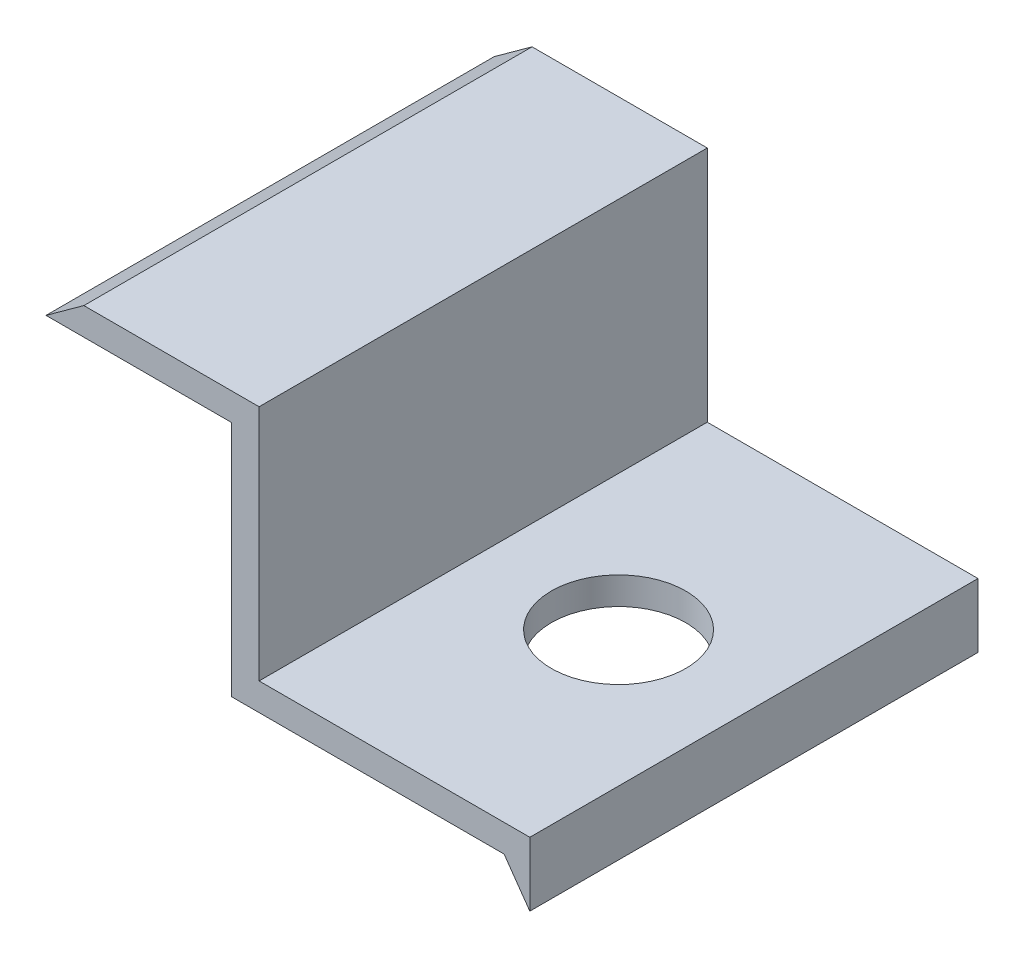
ISO-10303-21;
HEADER;
FILE_DESCRIPTION(('STEP AP214'),'2;1');
FILE_NAME('part.step','',(''),(''),'','','');
FILE_SCHEMA(('AUTOMOTIVE_DESIGN { 1 0 10303 214 1 1 1 1 }'));
ENDSEC;
DATA;
#1=APPLICATION_CONTEXT('core data for automotive mechanical design processes');
#2=APPLICATION_PROTOCOL_DEFINITION('international standard','automotive_design',2000,#1);
#3=PRODUCT_CONTEXT('',#1,'mechanical');
#4=PRODUCT('Part','Part','',(#3));
#5=PRODUCT_RELATED_PRODUCT_CATEGORY('part','',(#4));
#6=PRODUCT_DEFINITION_FORMATION('','',#4);
#7=PRODUCT_DEFINITION_CONTEXT('part definition',#1,'design');
#8=PRODUCT_DEFINITION('design','',#6,#7);
#9=PRODUCT_DEFINITION_SHAPE('','',#8);
#10=(LENGTH_UNIT() NAMED_UNIT(*) SI_UNIT(.MILLI.,.METRE.));
#11=(NAMED_UNIT(*) PLANE_ANGLE_UNIT() SI_UNIT($,.RADIAN.));
#12=(NAMED_UNIT(*) SI_UNIT($,.STERADIAN.) SOLID_ANGLE_UNIT());
#13=UNCERTAINTY_MEASURE_WITH_UNIT(LENGTH_MEASURE(1.E-05),#10,'distance_accuracy_value','');
#14=(GEOMETRIC_REPRESENTATION_CONTEXT(3) GLOBAL_UNCERTAINTY_ASSIGNED_CONTEXT((#13)) GLOBAL_UNIT_ASSIGNED_CONTEXT((#10,
#11,#12)) REPRESENTATION_CONTEXT('',''));
#15=CARTESIAN_POINT('',(0.,0.,0.));
#16=DIRECTION('',(0.,0.,1.));
#17=DIRECTION('',(1.,0.,0.));
#18=AXIS2_PLACEMENT_3D('',#15,#16,#17);
#19=CARTESIAN_POINT('',(-36.3976893498092,16.9055292448267,-37.338));
#20=DIRECTION('',(-0.586709511072015,0.809797474445084,0.));
#21=DIRECTION('',(-0.809797474445084,-0.586709511072015,0.));
#22=AXIS2_PLACEMENT_3D('',#19,#20,#21);
#23=PLANE('',#22);
#24=DIRECTION('',(-0.809797474445084,-0.586709511072015,0.));
#25=VECTOR('',#24,1.);
#26=CARTESIAN_POINT('',(-36.3976893498092,16.9055292448267,0.));
#27=LINE('',#26,#25);
#28=CARTESIAN_POINT('',(-33.2424702990749,19.1915292448267,0.));
#29=VERTEX_POINT('',#28);
#30=CARTESIAN_POINT('',(-36.3976893498092,16.9055292448267,0.));
#31=VERTEX_POINT('',#30);
#32=EDGE_CURVE('E137',#29,#31,#27,.T.);
#33=ORIENTED_EDGE('',*,*,#32,.F.);
#34=DIRECTION('',(0.,0.,1.));
#35=VECTOR('',#34,1.);
#36=CARTESIAN_POINT('',(-33.2424702990749,19.1915292448267,-37.338));
#37=LINE('',#36,#35);
#38=CARTESIAN_POINT('',(-33.2424702990749,19.1915292448267,-37.338));
#39=VERTEX_POINT('',#38);
#40=EDGE_CURVE('E11',#39,#29,#37,.T.);
#41=ORIENTED_EDGE('',*,*,#40,.F.);
#42=DIRECTION('',(-0.809797474445084,-0.586709511072015,0.));
#43=VECTOR('',#42,1.);
#44=CARTESIAN_POINT('',(-36.3976893498092,16.9055292448267,-37.338));
#45=LINE('',#44,#43);
#46=CARTESIAN_POINT('',(-36.3976893498092,16.9055292448267,-37.338));
#47=VERTEX_POINT('',#46);
#48=EDGE_CURVE('E160',#39,#47,#45,.T.);
#49=ORIENTED_EDGE('',*,*,#48,.T.);
#50=DIRECTION('',(0.,0.,1.));
#51=VECTOR('',#50,1.);
#52=CARTESIAN_POINT('',(-36.3976893498092,16.9055292448267,-37.338));
#53=LINE('',#52,#51);
#54=EDGE_CURVE('E92',#47,#31,#53,.T.);
#55=ORIENTED_EDGE('',*,*,#54,.T.);
#56=EDGE_LOOP('',(#33,#41,#49,#55));
#57=FACE_BOUND('',#56,.T.);
#58=ADVANCED_FACE('F33',(#57),#23,.T.);
#59=CARTESIAN_POINT('',(-33.2424702990749,19.1915292448267,-37.338));
#60=DIRECTION('',(0.,1.,0.));
#61=DIRECTION('',(0.,0.,1.));
#62=AXIS2_PLACEMENT_3D('',#59,#60,#61);
#63=PLANE('',#62);
#64=DIRECTION('',(-1.,0.,0.));
#65=VECTOR('',#64,1.);
#66=CARTESIAN_POINT('',(-33.2424702990749,19.1915292448267,0.));
#67=LINE('',#66,#65);
#68=CARTESIAN_POINT('',(-18.6444545599601,19.1915292448267,0.));
#69=VERTEX_POINT('',#68);
#70=EDGE_CURVE('E158',#69,#29,#67,.T.);
#71=ORIENTED_EDGE('',*,*,#70,.F.);
#72=DIRECTION('',(0.,0.,1.));
#73=VECTOR('',#72,1.);
#74=CARTESIAN_POINT('',(-18.6444545599601,19.1915292448267,-37.338));
#75=LINE('',#74,#73);
#76=CARTESIAN_POINT('',(-18.6444545599601,19.1915292448267,-37.338));
#77=VERTEX_POINT('',#76);
#78=EDGE_CURVE('E42',#77,#69,#75,.T.);
#79=ORIENTED_EDGE('',*,*,#78,.F.);
#80=DIRECTION('',(-1.,0.,0.));
#81=VECTOR('',#80,1.);
#82=CARTESIAN_POINT('',(-33.2424702990749,19.1915292448267,-37.338));
#83=LINE('',#82,#81);
#84=EDGE_CURVE('E127',#77,#39,#83,.T.);
#85=ORIENTED_EDGE('',*,*,#84,.T.);
#86=ORIENTED_EDGE('',*,*,#40,.T.);
#87=EDGE_LOOP('',(#71,#79,#85,#86));
#88=FACE_BOUND('',#87,.T.);
#89=ADVANCED_FACE('F175',(#88),#63,.T.);
#90=CARTESIAN_POINT('',(-18.6444545599601,19.1915292448267,-37.338));
#91=DIRECTION('',(1.,0.,0.));
#92=DIRECTION('',(0.,1.,0.));
#93=AXIS2_PLACEMENT_3D('',#90,#91,#92);
#94=PLANE('',#93);
#95=DIRECTION('',(0.,1.,0.));
#96=VECTOR('',#95,1.);
#97=CARTESIAN_POINT('',(-18.6444545599601,19.1915292448267,0.));
#98=LINE('',#97,#96);
#99=CARTESIAN_POINT('',(-18.6444545599601,-0.593055444950513,0.));
#100=VERTEX_POINT('',#99);
#101=EDGE_CURVE('E114',#100,#69,#98,.T.);
#102=ORIENTED_EDGE('',*,*,#101,.F.);
#103=DIRECTION('',(0.,0.,1.));
#104=VECTOR('',#103,1.);
#105=CARTESIAN_POINT('',(-18.6444545599601,-0.593055444950513,-37.338));
#106=LINE('',#105,#104);
#107=CARTESIAN_POINT('',(-18.6444545599601,-0.593055444950513,-37.338));
#108=VERTEX_POINT('',#107);
#109=EDGE_CURVE('E109',#108,#100,#106,.T.);
#110=ORIENTED_EDGE('',*,*,#109,.F.);
#111=DIRECTION('',(0.,1.,0.));
#112=VECTOR('',#111,1.);
#113=CARTESIAN_POINT('',(-18.6444545599601,19.1915292448267,-37.338));
#114=LINE('',#113,#112);
#115=EDGE_CURVE('E112',#108,#77,#114,.T.);
#116=ORIENTED_EDGE('',*,*,#115,.T.);
#117=ORIENTED_EDGE('',*,*,#78,.T.);
#118=EDGE_LOOP('',(#102,#110,#116,#117));
#119=FACE_BOUND('',#118,.T.);
#120=ADVANCED_FACE('F111',(#119),#94,.T.);
#121=CARTESIAN_POINT('',(-18.6444545599601,-0.593055444950513,-37.338));
#122=DIRECTION('',(0.,1.,0.));
#123=DIRECTION('',(-1.,0.,0.));
#124=AXIS2_PLACEMENT_3D('',#121,#122,#123);
#125=PLANE('',#124);
#126=CARTESIAN_POINT('',(-7.36679631962675,-0.593055444950509,-18.669));
#127=DIRECTION('',(0.,1.,0.));
#128=DIRECTION('',(-1.,0.,0.));
#129=AXIS2_PLACEMENT_3D('',#126,#127,#128);
#130=CIRCLE('',#129,5.59696805727982);
#131=CARTESIAN_POINT('',(-12.9637643769066,-0.593055444950509,-18.669));
#132=VERTEX_POINT('',#131);
#133=EDGE_CURVE('E222',#132,#132,#130,.T.);
#134=ORIENTED_EDGE('',*,*,#133,.F.);
#135=EDGE_LOOP('',(#134));
#136=FACE_BOUND('',#135,.T.);
#137=DIRECTION('',(-1.,0.,0.));
#138=VECTOR('',#137,1.);
#139=CARTESIAN_POINT('',(-18.6444545599601,-0.593055444950513,0.));
#140=LINE('',#139,#138);
#141=CARTESIAN_POINT('',(3.91086192070662,-0.593055444950505,0.));
#142=VERTEX_POINT('',#141);
#143=EDGE_CURVE('E155',#142,#100,#140,.T.);
#144=ORIENTED_EDGE('',*,*,#143,.F.);
#145=DIRECTION('',(0.,0.,1.));
#146=VECTOR('',#145,1.);
#147=CARTESIAN_POINT('',(3.91086192070662,-0.593055444950505,-37.338));
#148=LINE('',#147,#146);
#149=CARTESIAN_POINT('',(3.91086192070662,-0.593055444950505,-37.338));
#150=VERTEX_POINT('',#149);
#151=EDGE_CURVE('E119',#150,#142,#148,.T.);
#152=ORIENTED_EDGE('',*,*,#151,.F.);
#153=DIRECTION('',(-1.,0.,0.));
#154=VECTOR('',#153,1.);
#155=CARTESIAN_POINT('',(-18.6444545599601,-0.593055444950513,-37.338));
#156=LINE('',#155,#154);
#157=EDGE_CURVE('E125',#150,#108,#156,.T.);
#158=ORIENTED_EDGE('',*,*,#157,.T.);
#159=ORIENTED_EDGE('',*,*,#109,.T.);
#160=EDGE_LOOP('',(#144,#152,#158,#159));
#161=FACE_BOUND('',#160,.T.);
#162=ADVANCED_FACE('F129',(#136,#161),#125,.T.);
#163=CARTESIAN_POINT('',(3.91086192070662,-0.593055444950505,-37.338));
#164=DIRECTION('',(1.,0.,0.));
#165=DIRECTION('',(0.,1.,0.));
#166=AXIS2_PLACEMENT_3D('',#163,#164,#165);
#167=PLANE('',#166);
#168=DIRECTION('',(0.,1.,0.));
#169=VECTOR('',#168,1.);
#170=CARTESIAN_POINT('',(3.91086192070662,-0.593055444950505,0.));
#171=LINE('',#170,#169);
#172=CARTESIAN_POINT('',(3.91086192070662,-5.92705544495051,0.));
#173=VERTEX_POINT('',#172);
#174=EDGE_CURVE('E152',#173,#142,#171,.T.);
#175=ORIENTED_EDGE('',*,*,#174,.F.);
#176=DIRECTION('',(0.,0.,1.));
#177=VECTOR('',#176,1.);
#178=CARTESIAN_POINT('',(3.91086192070662,-5.92705544495051,-37.338));
#179=LINE('',#178,#177);
#180=CARTESIAN_POINT('',(3.91086192070662,-5.92705544495051,-37.338));
#181=VERTEX_POINT('',#180);
#182=EDGE_CURVE('E164',#181,#173,#179,.T.);
#183=ORIENTED_EDGE('',*,*,#182,.F.);
#184=DIRECTION('',(0.,1.,0.));
#185=VECTOR('',#184,1.);
#186=CARTESIAN_POINT('',(3.91086192070662,-0.593055444950505,-37.338));
#187=LINE('',#186,#185);
#188=EDGE_CURVE('E130',#181,#150,#187,.T.);
#189=ORIENTED_EDGE('',*,*,#188,.T.);
#190=ORIENTED_EDGE('',*,*,#151,.T.);
#191=EDGE_LOOP('',(#175,#183,#189,#190));
#192=FACE_BOUND('',#191,.T.);
#193=ADVANCED_FACE('F188',(#192),#167,.T.);
#194=CARTESIAN_POINT('',(3.91086192070662,-5.92705544495051,-37.338));
#195=DIRECTION('',(-0.818089487932644,-0.575090940403432,0.));
#196=DIRECTION('',(0.575090940403432,-0.818089487932644,0.));
#197=AXIS2_PLACEMENT_3D('',#194,#195,#196);
#198=PLANE('',#197);
#199=DIRECTION('',(0.575090940403432,-0.818089487932644,0.));
#200=VECTOR('',#199,1.);
#201=CARTESIAN_POINT('',(3.91086192070662,-5.92705544495051,0.));
#202=LINE('',#201,#200);
#203=CARTESIAN_POINT('',(1.76821467709117,-2.87905544495051,0.));
#204=VERTEX_POINT('',#203);
#205=EDGE_CURVE('E149',#204,#173,#202,.T.);
#206=ORIENTED_EDGE('',*,*,#205,.F.);
#207=DIRECTION('',(0.,0.,1.));
#208=VECTOR('',#207,1.);
#209=CARTESIAN_POINT('',(1.76821467709117,-2.87905544495051,-37.338));
#210=LINE('',#209,#208);
#211=CARTESIAN_POINT('',(1.76821467709117,-2.87905544495051,-37.338));
#212=VERTEX_POINT('',#211);
#213=EDGE_CURVE('E166',#212,#204,#210,.T.);
#214=ORIENTED_EDGE('',*,*,#213,.F.);
#215=DIRECTION('',(0.575090940403432,-0.818089487932644,0.));
#216=VECTOR('',#215,1.);
#217=CARTESIAN_POINT('',(3.91086192070662,-5.92705544495051,-37.338));
#218=LINE('',#217,#216);
#219=EDGE_CURVE('E132',#212,#181,#218,.T.);
#220=ORIENTED_EDGE('',*,*,#219,.T.);
#221=ORIENTED_EDGE('',*,*,#182,.T.);
#222=EDGE_LOOP('',(#206,#214,#220,#221));
#223=FACE_BOUND('',#222,.T.);
#224=ADVANCED_FACE('F192',(#223),#198,.T.);
#225=CARTESIAN_POINT('',(1.76821467709117,-2.87905544495051,-37.338));
#226=DIRECTION('',(0.,-1.,0.));
#227=DIRECTION('',(1.,0.,0.));
#228=AXIS2_PLACEMENT_3D('',#225,#226,#227);
#229=PLANE('',#228);
#230=CARTESIAN_POINT('',(-7.36679631962675,-2.87905544495051,-18.669));
#231=DIRECTION('',(0.,-1.,0.));
#232=DIRECTION('',(1.,0.,0.));
#233=AXIS2_PLACEMENT_3D('',#230,#231,#232);
#234=CIRCLE('',#233,5.59696805727982);
#235=CARTESIAN_POINT('',(-12.9637643769066,-2.87905544495052,-18.669));
#236=VERTEX_POINT('',#235);
#237=EDGE_CURVE('E36',#236,#236,#234,.T.);
#238=ORIENTED_EDGE('',*,*,#237,.F.);
#239=EDGE_LOOP('',(#238));
#240=FACE_BOUND('',#239,.T.);
#241=DIRECTION('',(1.,0.,0.));
#242=VECTOR('',#241,1.);
#243=CARTESIAN_POINT('',(1.76821467709117,-2.87905544495051,0.));
#244=LINE('',#243,#242);
#245=CARTESIAN_POINT('',(-20.9304545599601,-2.87905544495051,0.));
#246=VERTEX_POINT('',#245);
#247=EDGE_CURVE('E146',#246,#204,#244,.T.);
#248=ORIENTED_EDGE('',*,*,#247,.F.);
#249=DIRECTION('',(0.,0.,1.));
#250=VECTOR('',#249,1.);
#251=CARTESIAN_POINT('',(-20.9304545599601,-2.87905544495051,-37.338));
#252=LINE('',#251,#250);
#253=CARTESIAN_POINT('',(-20.9304545599601,-2.87905544495051,-37.338));
#254=VERTEX_POINT('',#253);
#255=EDGE_CURVE('E168',#254,#246,#252,.T.);
#256=ORIENTED_EDGE('',*,*,#255,.F.);
#257=DIRECTION('',(1.,0.,0.));
#258=VECTOR('',#257,1.);
#259=CARTESIAN_POINT('',(1.76821467709117,-2.87905544495051,-37.338));
#260=LINE('',#259,#258);
#261=EDGE_CURVE('E231',#254,#212,#260,.T.);
#262=ORIENTED_EDGE('',*,*,#261,.T.);
#263=ORIENTED_EDGE('',*,*,#213,.T.);
#264=EDGE_LOOP('',(#248,#256,#262,#263));
#265=FACE_BOUND('',#264,.T.);
#266=ADVANCED_FACE('F196',(#240,#265),#229,.T.);
#267=CARTESIAN_POINT('',(-20.9304545599601,-2.87905544495051,-37.338));
#268=DIRECTION('',(-1.,0.,0.));
#269=DIRECTION('',(0.,-1.,0.));
#270=AXIS2_PLACEMENT_3D('',#267,#268,#269);
#271=PLANE('',#270);
#272=DIRECTION('',(0.,-1.,0.));
#273=VECTOR('',#272,1.);
#274=CARTESIAN_POINT('',(-20.9304545599601,-2.87905544495051,0.));
#275=LINE('',#274,#273);
#276=CARTESIAN_POINT('',(-20.9304545599601,16.9055292448267,0.));
#277=VERTEX_POINT('',#276);
#278=EDGE_CURVE('E143',#277,#246,#275,.T.);
#279=ORIENTED_EDGE('',*,*,#278,.F.);
#280=DIRECTION('',(0.,0.,1.));
#281=VECTOR('',#280,1.);
#282=CARTESIAN_POINT('',(-20.9304545599601,16.9055292448267,-37.338));
#283=LINE('',#282,#281);
#284=CARTESIAN_POINT('',(-20.9304545599601,16.9055292448267,-37.338));
#285=VERTEX_POINT('',#284);
#286=EDGE_CURVE('E170',#285,#277,#283,.T.);
#287=ORIENTED_EDGE('',*,*,#286,.F.);
#288=DIRECTION('',(0.,-1.,0.));
#289=VECTOR('',#288,1.);
#290=CARTESIAN_POINT('',(-20.9304545599601,-2.87905544495051,-37.338));
#291=LINE('',#290,#289);
#292=EDGE_CURVE('E228',#285,#254,#291,.T.);
#293=ORIENTED_EDGE('',*,*,#292,.T.);
#294=ORIENTED_EDGE('',*,*,#255,.T.);
#295=EDGE_LOOP('',(#279,#287,#293,#294));
#296=FACE_BOUND('',#295,.T.);
#297=ADVANCED_FACE('F200',(#296),#271,.T.);
#298=CARTESIAN_POINT('',(-20.9304545599601,16.9055292448267,-37.338));
#299=DIRECTION('',(0.,-1.,0.));
#300=DIRECTION('',(1.,0.,0.));
#301=AXIS2_PLACEMENT_3D('',#298,#299,#300);
#302=PLANE('',#301);
#303=DIRECTION('',(1.,0.,0.));
#304=VECTOR('',#303,1.);
#305=CARTESIAN_POINT('',(-20.9304545599601,16.9055292448267,0.));
#306=LINE('',#305,#304);
#307=EDGE_CURVE('E140',#31,#277,#306,.T.);
#308=ORIENTED_EDGE('',*,*,#307,.F.);
#309=ORIENTED_EDGE('',*,*,#54,.F.);
#310=DIRECTION('',(1.,0.,0.));
#311=VECTOR('',#310,1.);
#312=CARTESIAN_POINT('',(-20.9304545599601,16.9055292448267,-37.338));
#313=LINE('',#312,#311);
#314=EDGE_CURVE('E226',#47,#285,#313,.T.);
#315=ORIENTED_EDGE('',*,*,#314,.T.);
#316=ORIENTED_EDGE('',*,*,#286,.T.);
#317=EDGE_LOOP('',(#308,#309,#315,#316));
#318=FACE_BOUND('',#317,.T.);
#319=ADVANCED_FACE('F171',(#318),#302,.T.);
#320=CARTESIAN_POINT('',(0.,0.,-37.338));
#321=DIRECTION('',(0.,0.,1.));
#322=DIRECTION('',(1.,0.,0.));
#323=AXIS2_PLACEMENT_3D('',#320,#321,#322);
#324=PLANE('',#323);
#325=ORIENTED_EDGE('',*,*,#48,.F.);
#326=ORIENTED_EDGE('',*,*,#84,.F.);
#327=ORIENTED_EDGE('',*,*,#115,.F.);
#328=ORIENTED_EDGE('',*,*,#157,.F.);
#329=ORIENTED_EDGE('',*,*,#188,.F.);
#330=ORIENTED_EDGE('',*,*,#219,.F.);
#331=ORIENTED_EDGE('',*,*,#261,.F.);
#332=ORIENTED_EDGE('',*,*,#292,.F.);
#333=ORIENTED_EDGE('',*,*,#314,.F.);
#334=EDGE_LOOP('',(#325,#326,#327,#328,#329,#330,#331,#332,#333));
#335=FACE_BOUND('',#334,.T.);
#336=ADVANCED_FACE('F123',(#335),#324,.F.);
#337=CARTESIAN_POINT('',(0.,0.,0.));
#338=DIRECTION('',(0.,0.,1.));
#339=DIRECTION('',(1.,0.,0.));
#340=AXIS2_PLACEMENT_3D('',#337,#338,#339);
#341=PLANE('',#340);
#342=ORIENTED_EDGE('',*,*,#32,.T.);
#343=ORIENTED_EDGE('',*,*,#307,.T.);
#344=ORIENTED_EDGE('',*,*,#278,.T.);
#345=ORIENTED_EDGE('',*,*,#247,.T.);
#346=ORIENTED_EDGE('',*,*,#205,.T.);
#347=ORIENTED_EDGE('',*,*,#174,.T.);
#348=ORIENTED_EDGE('',*,*,#143,.T.);
#349=ORIENTED_EDGE('',*,*,#101,.T.);
#350=ORIENTED_EDGE('',*,*,#70,.T.);
#351=EDGE_LOOP('',(#342,#343,#344,#345,#346,#347,#348,#349,#350));
#352=FACE_BOUND('',#351,.T.);
#353=ADVANCED_FACE('F174',(#352),#341,.T.);
#354=CARTESIAN_POINT('',(-7.36679631962673,-37.9310554449505,-18.669));
#355=DIRECTION('',(0.,1.,0.));
#356=DIRECTION('',(-1.,0.,0.));
#357=AXIS2_PLACEMENT_3D('',#354,#355,#356);
#358=CYLINDRICAL_SURFACE('',#357,5.59696805727982);
#359=CARTESIAN_POINT('',(-12.9637643769066,-2.87905544495052,-18.669));
#360=CARTESIAN_POINT('',(-12.9637643769066,-2.85524294495052,-18.669));
#361=CARTESIAN_POINT('',(-12.9637643769066,-2.83143044495052,-18.669));
#362=CARTESIAN_POINT('',(-12.9637643769066,-2.78380544495052,-18.669));
#363=CARTESIAN_POINT('',(-12.9637643769066,-2.75999294495052,-18.669));
#364=CARTESIAN_POINT('',(-12.9637643769066,-2.71236794495052,-18.669));
#365=CARTESIAN_POINT('',(-12.9637643769066,-2.68855544495052,-18.669));
#366=CARTESIAN_POINT('',(-12.9637643769066,-2.64093044495052,-18.669));
#367=CARTESIAN_POINT('',(-12.9637643769066,-2.61711794495052,-18.669));
#368=CARTESIAN_POINT('',(-12.9637643769066,-2.56949294495052,-18.669));
#369=CARTESIAN_POINT('',(-12.9637643769066,-2.54568044495052,-18.669));
#370=CARTESIAN_POINT('',(-12.9637643769066,-2.49805544495052,-18.669));
#371=CARTESIAN_POINT('',(-12.9637643769066,-2.47424294495052,-18.669));
#372=CARTESIAN_POINT('',(-12.9637643769066,-2.42661794495052,-18.669));
#373=CARTESIAN_POINT('',(-12.9637643769066,-2.40280544495052,-18.669));
#374=CARTESIAN_POINT('',(-12.9637643769066,-2.35518044495052,-18.669));
#375=CARTESIAN_POINT('',(-12.9637643769066,-2.33136794495052,-18.669));
#376=CARTESIAN_POINT('',(-12.9637643769066,-2.28374294495052,-18.669));
#377=CARTESIAN_POINT('',(-12.9637643769066,-2.25993044495052,-18.669));
#378=CARTESIAN_POINT('',(-12.9637643769066,-2.21230544495052,-18.669));
#379=CARTESIAN_POINT('',(-12.9637643769066,-2.18849294495052,-18.669));
#380=CARTESIAN_POINT('',(-12.9637643769066,-2.14086794495052,-18.669));
#381=CARTESIAN_POINT('',(-12.9637643769066,-2.11705544495052,-18.669));
#382=CARTESIAN_POINT('',(-12.9637643769066,-2.06943044495052,-18.669));
#383=CARTESIAN_POINT('',(-12.9637643769066,-2.04561794495052,-18.669));
#384=CARTESIAN_POINT('',(-12.9637643769066,-1.99799294495052,-18.669));
#385=CARTESIAN_POINT('',(-12.9637643769066,-1.97418044495052,-18.669));
#386=CARTESIAN_POINT('',(-12.9637643769066,-1.92655544495051,-18.669));
#387=CARTESIAN_POINT('',(-12.9637643769066,-1.90274294495051,-18.669));
#388=CARTESIAN_POINT('',(-12.9637643769066,-1.85511794495051,-18.669));
#389=CARTESIAN_POINT('',(-12.9637643769066,-1.83130544495051,-18.669));
#390=CARTESIAN_POINT('',(-12.9637643769066,-1.78368044495051,-18.669));
#391=CARTESIAN_POINT('',(-12.9637643769066,-1.75986794495051,-18.669));
#392=CARTESIAN_POINT('',(-12.9637643769066,-1.71224294495051,-18.669));
#393=CARTESIAN_POINT('',(-12.9637643769066,-1.68843044495051,-18.669));
#394=CARTESIAN_POINT('',(-12.9637643769066,-1.64080544495051,-18.669));
#395=CARTESIAN_POINT('',(-12.9637643769066,-1.61699294495051,-18.669));
#396=CARTESIAN_POINT('',(-12.9637643769066,-1.56936794495051,-18.669));
#397=CARTESIAN_POINT('',(-12.9637643769066,-1.54555544495051,-18.669));
#398=CARTESIAN_POINT('',(-12.9637643769066,-1.49793044495051,-18.669));
#399=CARTESIAN_POINT('',(-12.9637643769066,-1.47411794495051,-18.669));
#400=CARTESIAN_POINT('',(-12.9637643769066,-1.42649294495051,-18.669));
#401=CARTESIAN_POINT('',(-12.9637643769066,-1.40268044495051,-18.669));
#402=CARTESIAN_POINT('',(-12.9637643769066,-1.35505544495051,-18.669));
#403=CARTESIAN_POINT('',(-12.9637643769066,-1.33124294495051,-18.669));
#404=CARTESIAN_POINT('',(-12.9637643769066,-1.28361794495051,-18.669));
#405=CARTESIAN_POINT('',(-12.9637643769066,-1.25980544495051,-18.669));
#406=CARTESIAN_POINT('',(-12.9637643769066,-1.21218044495051,-18.669));
#407=CARTESIAN_POINT('',(-12.9637643769066,-1.18836794495051,-18.669));
#408=CARTESIAN_POINT('',(-12.9637643769066,-1.14074294495051,-18.669));
#409=CARTESIAN_POINT('',(-12.9637643769066,-1.11693044495051,-18.669));
#410=CARTESIAN_POINT('',(-12.9637643769066,-1.06930544495051,-18.669));
#411=CARTESIAN_POINT('',(-12.9637643769066,-1.04549294495051,-18.669));
#412=CARTESIAN_POINT('',(-12.9637643769066,-0.997867944950511,-18.669));
#413=CARTESIAN_POINT('',(-12.9637643769066,-0.974055444950511,-18.669));
#414=CARTESIAN_POINT('',(-12.9637643769066,-0.926430444950511,-18.669));
#415=CARTESIAN_POINT('',(-12.9637643769066,-0.90261794495051,-18.669));
#416=CARTESIAN_POINT('',(-12.9637643769066,-0.85499294495051,-18.669));
#417=CARTESIAN_POINT('',(-12.9637643769066,-0.83118044495051,-18.669));
#418=CARTESIAN_POINT('',(-12.9637643769066,-0.78355544495051,-18.669));
#419=CARTESIAN_POINT('',(-12.9637643769066,-0.75974294495051,-18.669));
#420=CARTESIAN_POINT('',(-12.9637643769066,-0.71211794495051,-18.669));
#421=CARTESIAN_POINT('',(-12.9637643769066,-0.688305444950509,-18.669));
#422=CARTESIAN_POINT('',(-12.9637643769066,-0.640680444950509,-18.669));
#423=CARTESIAN_POINT('',(-12.9637643769066,-0.616867944950509,-18.669));
#424=CARTESIAN_POINT('',(-12.9637643769066,-0.593055444950509,-18.669));
#425=B_SPLINE_CURVE_WITH_KNOTS('',3,(#359,#360,#361,#362,#363,#364,#365,#366,#367,#368,#369,
#370,#371,#372,#373,#374,#375,#376,#377,#378,#379,#380,#381,#382,#383,#384,#385,#386,#387,#388,
#389,#390,#391,#392,#393,#394,#395,#396,#397,#398,#399,#400,#401,#402,#403,#404,#405,#406,#407,
#408,#409,#410,#411,#412,#413,#414,#415,#416,#417,#418,#419,#420,#421,#422,#423,#424),
.UNSPECIFIED.,.F.,.F.,(4,2,2,2,2,2,2,2,2,2,2,2,2,2,2,2,2,2,2,2,2,2,2,2,2,2,2,2,2,2,2,2,4),(0.,
0.0714375000000003,0.142875000000001,0.214312500000001,0.285750000000001,0.357187500000002,
0.428625000000002,0.500062500000002,0.571500000000003,0.642937500000003,0.714375000000003,
0.785812500000004,0.857250000000004,0.928687500000004,1.000125,1.0715625,1.14300000000001,
1.21443750000001,1.28587500000001,1.35731250000001,1.42875000000001,1.50018750000001,
1.57162500000001,1.64306250000001,1.71450000000001,1.78593750000001,1.85737500000001,
1.92881250000001,2.00025000000001,2.07168750000001,2.14312500000001,2.21456250000001,
2.28600000000001),.UNSPECIFIED.);
#426=EDGE_CURVE('BSEAM211',#236,#132,#425,.T.);
#427=ORIENTED_EDGE('',*,*,#237,.T.);
#428=ORIENTED_EDGE('',*,*,#133,.T.);
#429=ORIENTED_EDGE('',*,*,#426,.T.);
#430=ORIENTED_EDGE('',*,*,#426,.F.);
#431=EDGE_LOOP('',(#427,#429,#428,#430));
#432=FACE_BOUND('',#431,.T.);
#433=ADVANCED_FACE('F211',(#432),#358,.F.);
#434=CLOSED_SHELL('',(#58,#89,#120,#162,#193,#224,#266,#297,#319,#336,#353,#433));
#435=MANIFOLD_SOLID_BREP('B2',#434);
#436=ADVANCED_BREP_SHAPE_REPRESENTATION('',(#18,#435),#14);
#437=SHAPE_DEFINITION_REPRESENTATION(#9,#436);
ENDSEC;
END-ISO-10303-21;
